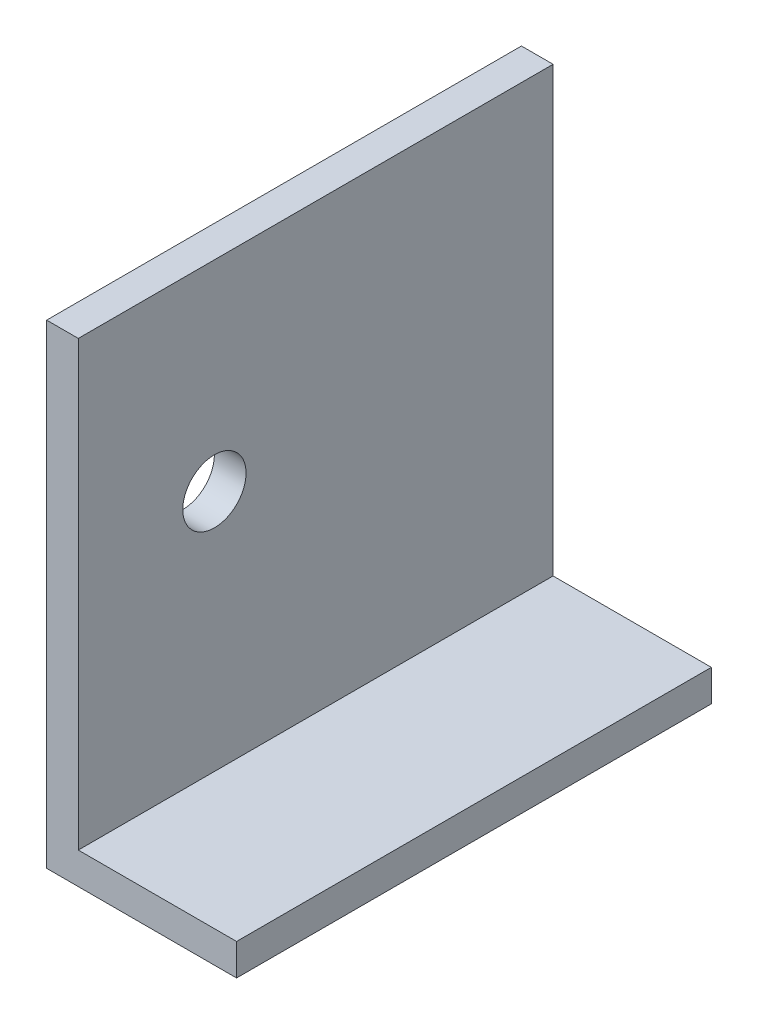
ISO-10303-21;
HEADER;
FILE_DESCRIPTION(('STEP AP214'),'2;1');
FILE_NAME('part.step','',(''),(''),'','','');
FILE_SCHEMA(('AUTOMOTIVE_DESIGN { 1 0 10303 214 1 1 1 1 }'));
ENDSEC;
DATA;
#1=APPLICATION_CONTEXT('core data for automotive mechanical design processes');
#2=APPLICATION_PROTOCOL_DEFINITION('international standard','automotive_design',2000,#1);
#3=PRODUCT_CONTEXT('',#1,'mechanical');
#4=PRODUCT('Part','Part','',(#3));
#5=PRODUCT_RELATED_PRODUCT_CATEGORY('part','',(#4));
#6=PRODUCT_DEFINITION_FORMATION('','',#4);
#7=PRODUCT_DEFINITION_CONTEXT('part definition',#1,'design');
#8=PRODUCT_DEFINITION('design','',#6,#7);
#9=PRODUCT_DEFINITION_SHAPE('','',#8);
#10=(LENGTH_UNIT() NAMED_UNIT(*) SI_UNIT(.MILLI.,.METRE.));
#11=(NAMED_UNIT(*) PLANE_ANGLE_UNIT() SI_UNIT($,.RADIAN.));
#12=(NAMED_UNIT(*) SI_UNIT($,.STERADIAN.) SOLID_ANGLE_UNIT());
#13=UNCERTAINTY_MEASURE_WITH_UNIT(LENGTH_MEASURE(1.E-05),#10,'distance_accuracy_value','');
#14=(GEOMETRIC_REPRESENTATION_CONTEXT(3) GLOBAL_UNCERTAINTY_ASSIGNED_CONTEXT((#13)) GLOBAL_UNIT_ASSIGNED_CONTEXT((#10,
#11,#12)) REPRESENTATION_CONTEXT('',''));
#15=CARTESIAN_POINT('',(0.,0.,0.));
#16=DIRECTION('',(0.,0.,1.));
#17=DIRECTION('',(1.,0.,0.));
#18=AXIS2_PLACEMENT_3D('',#15,#16,#17);
#19=CARTESIAN_POINT('',(0.,45.,45.));
#20=DIRECTION('',(1.,0.,0.));
#21=DIRECTION('',(0.,1.,0.));
#22=AXIS2_PLACEMENT_3D('',#19,#20,#21);
#23=PLANE('',#22);
#24=CARTESIAN_POINT('',(0.,26.,32.1));
#25=DIRECTION('',(1.,0.,0.));
#26=DIRECTION('',(0.,1.,0.));
#27=AXIS2_PLACEMENT_3D('',#24,#25,#26);
#28=CIRCLE('',#27,3.);
#29=CARTESIAN_POINT('',(0.,29.,32.1));
#30=VERTEX_POINT('',#29);
#31=EDGE_CURVE('E110',#30,#30,#28,.T.);
#32=ORIENTED_EDGE('',*,*,#31,.T.);
#33=EDGE_LOOP('',(#32));
#34=FACE_BOUND('',#33,.T.);
#35=DIRECTION('',(0.,-1.,0.));
#36=VECTOR('',#35,1.);
#37=CARTESIAN_POINT('',(0.,45.,0.));
#38=LINE('',#37,#36);
#39=CARTESIAN_POINT('',(0.,45.,0.));
#40=VERTEX_POINT('',#39);
#41=CARTESIAN_POINT('',(0.,0.,0.));
#42=VERTEX_POINT('',#41);
#43=EDGE_CURVE('E129',#40,#42,#38,.T.);
#44=ORIENTED_EDGE('',*,*,#43,.T.);
#45=DIRECTION('',(0.,0.,-1.));
#46=VECTOR('',#45,1.);
#47=CARTESIAN_POINT('',(0.,0.,45.));
#48=LINE('',#47,#46);
#49=CARTESIAN_POINT('',(0.,0.,45.));
#50=VERTEX_POINT('',#49);
#51=EDGE_CURVE('E126',#50,#42,#48,.T.);
#52=ORIENTED_EDGE('',*,*,#51,.F.);
#53=DIRECTION('',(0.,-1.,0.));
#54=VECTOR('',#53,1.);
#55=CARTESIAN_POINT('',(0.,45.,45.));
#56=LINE('',#55,#54);
#57=CARTESIAN_POINT('',(0.,45.,45.));
#58=VERTEX_POINT('',#57);
#59=EDGE_CURVE('E128',#58,#50,#56,.T.);
#60=ORIENTED_EDGE('',*,*,#59,.F.);
#61=DIRECTION('',(0.,0.,-1.));
#62=VECTOR('',#61,1.);
#63=CARTESIAN_POINT('',(0.,45.,45.));
#64=LINE('',#63,#62);
#65=EDGE_CURVE('E123',#58,#40,#64,.T.);
#66=ORIENTED_EDGE('',*,*,#65,.T.);
#67=EDGE_LOOP('',(#44,#52,#60,#66));
#68=FACE_BOUND('',#67,.T.);
#69=ADVANCED_FACE('F59',(#34,#68),#23,.F.);
#70=CARTESIAN_POINT('',(0.,45.,45.));
#71=DIRECTION('',(0.,1.,0.));
#72=DIRECTION('',(0.,0.,1.));
#73=AXIS2_PLACEMENT_3D('',#70,#71,#72);
#74=PLANE('',#73);
#75=DIRECTION('',(1.,0.,0.));
#76=VECTOR('',#75,1.);
#77=CARTESIAN_POINT('',(0.,45.,0.));
#78=LINE('',#77,#76);
#79=CARTESIAN_POINT('',(3.,45.,0.));
#80=VERTEX_POINT('',#79);
#81=EDGE_CURVE('E133',#40,#80,#78,.T.);
#82=ORIENTED_EDGE('',*,*,#81,.F.);
#83=ORIENTED_EDGE('',*,*,#65,.F.);
#84=DIRECTION('',(1.,0.,0.));
#85=VECTOR('',#84,1.);
#86=CARTESIAN_POINT('',(0.,45.,45.));
#87=LINE('',#86,#85);
#88=CARTESIAN_POINT('',(3.,45.,45.));
#89=VERTEX_POINT('',#88);
#90=EDGE_CURVE('E139',#58,#89,#87,.T.);
#91=ORIENTED_EDGE('',*,*,#90,.T.);
#92=DIRECTION('',(0.,0.,-1.));
#93=VECTOR('',#92,1.);
#94=CARTESIAN_POINT('',(3.,45.,45.));
#95=LINE('',#94,#93);
#96=EDGE_CURVE('E69',#89,#80,#95,.T.);
#97=ORIENTED_EDGE('',*,*,#96,.T.);
#98=EDGE_LOOP('',(#82,#83,#91,#97));
#99=FACE_BOUND('',#98,.T.);
#100=ADVANCED_FACE('F172',(#99),#74,.T.);
#101=CARTESIAN_POINT('',(0.,0.,0.));
#102=DIRECTION('',(0.,0.,-1.));
#103=DIRECTION('',(-1.,0.,0.));
#104=AXIS2_PLACEMENT_3D('',#101,#102,#103);
#105=PLANE('',#104);
#106=DIRECTION('',(1.,0.,0.));
#107=VECTOR('',#106,1.);
#108=CARTESIAN_POINT('',(0.,0.,0.));
#109=LINE('',#108,#107);
#110=CARTESIAN_POINT('',(18.,0.,0.));
#111=VERTEX_POINT('',#110);
#112=EDGE_CURVE('E94',#42,#111,#109,.T.);
#113=ORIENTED_EDGE('',*,*,#112,.F.);
#114=ORIENTED_EDGE('',*,*,#43,.F.);
#115=ORIENTED_EDGE('',*,*,#81,.T.);
#116=DIRECTION('',(0.,-1.,0.));
#117=VECTOR('',#116,1.);
#118=CARTESIAN_POINT('',(3.,45.,0.));
#119=LINE('',#118,#117);
#120=CARTESIAN_POINT('',(3.,3.00000000000002,0.));
#121=VERTEX_POINT('',#120);
#122=EDGE_CURVE('E115',#80,#121,#119,.T.);
#123=ORIENTED_EDGE('',*,*,#122,.T.);
#124=DIRECTION('',(1.,0.,0.));
#125=VECTOR('',#124,1.);
#126=CARTESIAN_POINT('',(3.,3.,0.));
#127=LINE('',#126,#125);
#128=CARTESIAN_POINT('',(18.,3.,0.));
#129=VERTEX_POINT('',#128);
#130=EDGE_CURVE('E101',#121,#129,#127,.T.);
#131=ORIENTED_EDGE('',*,*,#130,.T.);
#132=DIRECTION('',(0.,-1.,0.));
#133=VECTOR('',#132,1.);
#134=CARTESIAN_POINT('',(18.,3.,0.));
#135=LINE('',#134,#133);
#136=EDGE_CURVE('E108',#129,#111,#135,.T.);
#137=ORIENTED_EDGE('',*,*,#136,.T.);
#138=EDGE_LOOP('',(#113,#114,#115,#123,#131,#137));
#139=FACE_BOUND('',#138,.T.);
#140=ADVANCED_FACE('F112',(#139),#105,.T.);
#141=CARTESIAN_POINT('',(0.,0.,45.));
#142=DIRECTION('',(0.,0.,-1.));
#143=DIRECTION('',(-1.,0.,0.));
#144=AXIS2_PLACEMENT_3D('',#141,#142,#143);
#145=PLANE('',#144);
#146=DIRECTION('',(1.,0.,0.));
#147=VECTOR('',#146,1.);
#148=CARTESIAN_POINT('',(0.,0.,45.));
#149=LINE('',#148,#147);
#150=CARTESIAN_POINT('',(18.,0.,45.));
#151=VERTEX_POINT('',#150);
#152=EDGE_CURVE('E132',#50,#151,#149,.T.);
#153=ORIENTED_EDGE('',*,*,#152,.T.);
#154=DIRECTION('',(0.,-1.,0.));
#155=VECTOR('',#154,1.);
#156=CARTESIAN_POINT('',(18.,3.,45.));
#157=LINE('',#156,#155);
#158=CARTESIAN_POINT('',(18.,3.,45.));
#159=VERTEX_POINT('',#158);
#160=EDGE_CURVE('E116',#159,#151,#157,.T.);
#161=ORIENTED_EDGE('',*,*,#160,.F.);
#162=DIRECTION('',(1.,0.,0.));
#163=VECTOR('',#162,1.);
#164=CARTESIAN_POINT('',(3.,3.,45.));
#165=LINE('',#164,#163);
#166=CARTESIAN_POINT('',(3.,3.00000000000002,45.));
#167=VERTEX_POINT('',#166);
#168=EDGE_CURVE('E103',#167,#159,#165,.T.);
#169=ORIENTED_EDGE('',*,*,#168,.F.);
#170=DIRECTION('',(0.,-1.,0.));
#171=VECTOR('',#170,1.);
#172=CARTESIAN_POINT('',(3.,45.,45.));
#173=LINE('',#172,#171);
#174=EDGE_CURVE('E142',#89,#167,#173,.T.);
#175=ORIENTED_EDGE('',*,*,#174,.F.);
#176=ORIENTED_EDGE('',*,*,#90,.F.);
#177=ORIENTED_EDGE('',*,*,#59,.T.);
#178=EDGE_LOOP('',(#153,#161,#169,#175,#176,#177));
#179=FACE_BOUND('',#178,.T.);
#180=ADVANCED_FACE('F159',(#179),#145,.F.);
#181=CARTESIAN_POINT('',(3.,45.,45.));
#182=DIRECTION('',(1.,0.,0.));
#183=DIRECTION('',(0.,1.,0.));
#184=AXIS2_PLACEMENT_3D('',#181,#182,#183);
#185=PLANE('',#184);
#186=CARTESIAN_POINT('',(3.,26.,32.1));
#187=DIRECTION('',(1.,0.,0.));
#188=DIRECTION('',(0.,1.,0.));
#189=AXIS2_PLACEMENT_3D('',#186,#187,#188);
#190=CIRCLE('',#189,3.);
#191=CARTESIAN_POINT('',(3.,29.,32.1));
#192=VERTEX_POINT('',#191);
#193=EDGE_CURVE('E148',#192,#192,#190,.T.);
#194=ORIENTED_EDGE('',*,*,#193,.F.);
#195=EDGE_LOOP('',(#194));
#196=FACE_BOUND('',#195,.T.);
#197=ORIENTED_EDGE('',*,*,#174,.T.);
#198=DIRECTION('',(0.,0.,-1.));
#199=VECTOR('',#198,1.);
#200=CARTESIAN_POINT('',(3.,3.,45.));
#201=LINE('',#200,#199);
#202=EDGE_CURVE('E12',#167,#121,#201,.T.);
#203=ORIENTED_EDGE('',*,*,#202,.T.);
#204=ORIENTED_EDGE('',*,*,#122,.F.);
#205=ORIENTED_EDGE('',*,*,#96,.F.);
#206=EDGE_LOOP('',(#197,#203,#204,#205));
#207=FACE_BOUND('',#206,.T.);
#208=ADVANCED_FACE('F155',(#196,#207),#185,.T.);
#209=CARTESIAN_POINT('',(0.,0.,45.));
#210=DIRECTION('',(0.,1.,0.));
#211=DIRECTION('',(0.,0.,1.));
#212=AXIS2_PLACEMENT_3D('',#209,#210,#211);
#213=PLANE('',#212);
#214=ORIENTED_EDGE('',*,*,#112,.T.);
#215=DIRECTION('',(0.,0.,-1.));
#216=VECTOR('',#215,1.);
#217=CARTESIAN_POINT('',(18.,0.,45.));
#218=LINE('',#217,#216);
#219=EDGE_CURVE('E63',#151,#111,#218,.T.);
#220=ORIENTED_EDGE('',*,*,#219,.F.);
#221=ORIENTED_EDGE('',*,*,#152,.F.);
#222=ORIENTED_EDGE('',*,*,#51,.T.);
#223=EDGE_LOOP('',(#214,#220,#221,#222));
#224=FACE_BOUND('',#223,.T.);
#225=ADVANCED_FACE('F158',(#224),#213,.F.);
#226=CARTESIAN_POINT('',(18.,3.,45.));
#227=DIRECTION('',(1.,0.,0.));
#228=DIRECTION('',(0.,1.,0.));
#229=AXIS2_PLACEMENT_3D('',#226,#227,#228);
#230=PLANE('',#229);
#231=ORIENTED_EDGE('',*,*,#136,.F.);
#232=DIRECTION('',(0.,0.,-1.));
#233=VECTOR('',#232,1.);
#234=CARTESIAN_POINT('',(18.,3.,45.));
#235=LINE('',#234,#233);
#236=EDGE_CURVE('E97',#159,#129,#235,.T.);
#237=ORIENTED_EDGE('',*,*,#236,.F.);
#238=ORIENTED_EDGE('',*,*,#160,.T.);
#239=ORIENTED_EDGE('',*,*,#219,.T.);
#240=EDGE_LOOP('',(#231,#237,#238,#239));
#241=FACE_BOUND('',#240,.T.);
#242=ADVANCED_FACE('F61',(#241),#230,.T.);
#243=CARTESIAN_POINT('',(3.,3.,45.));
#244=DIRECTION('',(0.,1.,0.));
#245=DIRECTION('',(0.,0.,1.));
#246=AXIS2_PLACEMENT_3D('',#243,#244,#245);
#247=PLANE('',#246);
#248=ORIENTED_EDGE('',*,*,#130,.F.);
#249=ORIENTED_EDGE('',*,*,#202,.F.);
#250=ORIENTED_EDGE('',*,*,#168,.T.);
#251=ORIENTED_EDGE('',*,*,#236,.T.);
#252=EDGE_LOOP('',(#248,#249,#250,#251));
#253=FACE_BOUND('',#252,.T.);
#254=ADVANCED_FACE('F99',(#253),#247,.T.);
#255=CARTESIAN_POINT('',(-61.5,26.,32.1));
#256=DIRECTION('',(1.,0.,0.));
#257=DIRECTION('',(0.,1.,0.));
#258=AXIS2_PLACEMENT_3D('',#255,#256,#257);
#259=CYLINDRICAL_SURFACE('',#258,3.);
#260=ORIENTED_EDGE('',*,*,#193,.T.);
#261=EDGE_LOOP('',(#260));
#262=FACE_BOUND('',#261,.T.);
#263=ORIENTED_EDGE('',*,*,#31,.F.);
#264=EDGE_LOOP('',(#263));
#265=FACE_BOUND('',#264,.T.);
#266=ADVANCED_FACE('F152',(#262,#265),#259,.F.);
#267=CLOSED_SHELL('',(#69,#100,#140,#180,#208,#225,#242,#254,#266));
#268=MANIFOLD_SOLID_BREP('B2',#267);
#269=ADVANCED_BREP_SHAPE_REPRESENTATION('',(#18,#268),#14);
#270=SHAPE_DEFINITION_REPRESENTATION(#9,#269);
ENDSEC;
END-ISO-10303-21;
